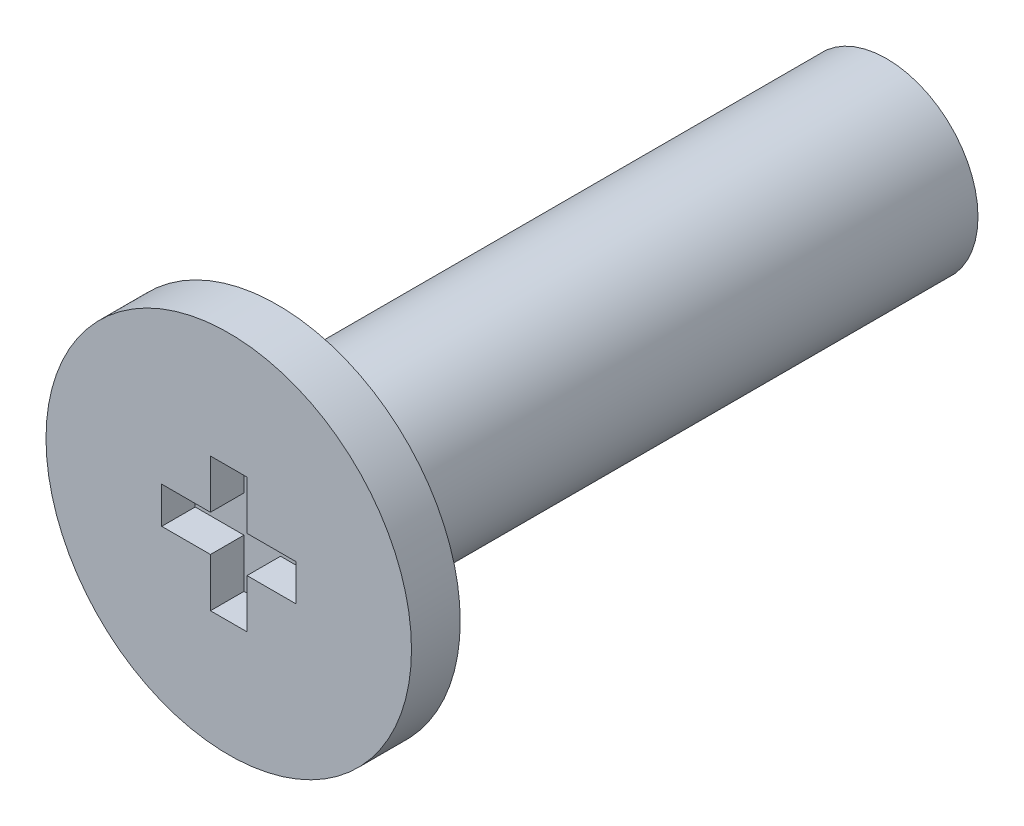
ISO-10303-21;
HEADER;
FILE_DESCRIPTION(('STEP AP214'),'2;1');
FILE_NAME('part.step','',(''),(''),'','','');
FILE_SCHEMA(('AUTOMOTIVE_DESIGN { 1 0 10303 214 1 1 1 1 }'));
ENDSEC;
DATA;
#1=APPLICATION_CONTEXT('core data for automotive mechanical design processes');
#2=APPLICATION_PROTOCOL_DEFINITION('international standard','automotive_design',2000,#1);
#3=PRODUCT_CONTEXT('',#1,'mechanical');
#4=PRODUCT('Part','Part','',(#3));
#5=PRODUCT_RELATED_PRODUCT_CATEGORY('part','',(#4));
#6=PRODUCT_DEFINITION_FORMATION('','',#4);
#7=PRODUCT_DEFINITION_CONTEXT('part definition',#1,'design');
#8=PRODUCT_DEFINITION('design','',#6,#7);
#9=PRODUCT_DEFINITION_SHAPE('','',#8);
#10=(LENGTH_UNIT() NAMED_UNIT(*) SI_UNIT(.MILLI.,.METRE.));
#11=(NAMED_UNIT(*) PLANE_ANGLE_UNIT() SI_UNIT($,.RADIAN.));
#12=(NAMED_UNIT(*) SI_UNIT($,.STERADIAN.) SOLID_ANGLE_UNIT());
#13=UNCERTAINTY_MEASURE_WITH_UNIT(LENGTH_MEASURE(1.E-05),#10,'distance_accuracy_value','');
#14=(GEOMETRIC_REPRESENTATION_CONTEXT(3) GLOBAL_UNCERTAINTY_ASSIGNED_CONTEXT((#13)) GLOBAL_UNIT_ASSIGNED_CONTEXT((#10,
#11,#12)) REPRESENTATION_CONTEXT('',''));
#15=CARTESIAN_POINT('',(0.,0.,0.));
#16=DIRECTION('',(0.,0.,1.));
#17=DIRECTION('',(1.,0.,0.));
#18=AXIS2_PLACEMENT_3D('',#15,#16,#17);
#19=CARTESIAN_POINT('',(0.,0.,-10.));
#20=DIRECTION('',(0.,0.,1.));
#21=DIRECTION('',(1.,0.,0.));
#22=AXIS2_PLACEMENT_3D('',#19,#20,#21);
#23=CYLINDRICAL_SURFACE('',#22,1.5);
#24=CARTESIAN_POINT('',(0.,0.,-10.));
#25=DIRECTION('',(0.,0.,1.));
#26=DIRECTION('',(1.,0.,0.));
#27=AXIS2_PLACEMENT_3D('',#24,#25,#26);
#28=CIRCLE('',#27,1.5);
#29=CARTESIAN_POINT('',(1.5,0.,-10.));
#30=VERTEX_POINT('',#29);
#31=EDGE_CURVE('E212',#30,#30,#28,.T.);
#32=ORIENTED_EDGE('',*,*,#31,.T.);
#33=EDGE_LOOP('',(#32));
#34=FACE_BOUND('',#33,.T.);
#35=CARTESIAN_POINT('',(0.,0.,0.));
#36=DIRECTION('',(0.,0.,1.));
#37=DIRECTION('',(1.,0.,0.));
#38=AXIS2_PLACEMENT_3D('',#35,#36,#37);
#39=CIRCLE('',#38,1.5);
#40=CARTESIAN_POINT('',(1.5,0.,0.));
#41=VERTEX_POINT('',#40);
#42=EDGE_CURVE('E208',#41,#41,#39,.T.);
#43=ORIENTED_EDGE('',*,*,#42,.F.);
#44=EDGE_LOOP('',(#43));
#45=FACE_BOUND('',#44,.T.);
#46=ADVANCED_FACE('F41',(#34,#45),#23,.T.);
#47=CARTESIAN_POINT('',(0.,0.,-10.));
#48=DIRECTION('',(0.,0.,1.));
#49=DIRECTION('',(1.,0.,0.));
#50=AXIS2_PLACEMENT_3D('',#47,#48,#49);
#51=PLANE('',#50);
#52=ORIENTED_EDGE('',*,*,#31,.F.);
#53=EDGE_LOOP('',(#52));
#54=FACE_BOUND('',#53,.T.);
#55=ADVANCED_FACE('F281',(#54),#51,.F.);
#56=CARTESIAN_POINT('',(0.,0.,0.));
#57=DIRECTION('',(0.,0.,1.));
#58=DIRECTION('',(1.,0.,0.));
#59=AXIS2_PLACEMENT_3D('',#56,#57,#58);
#60=PLANE('',#59);
#61=ORIENTED_EDGE('',*,*,#42,.T.);
#62=EDGE_LOOP('',(#61));
#63=FACE_BOUND('',#62,.T.);
#64=CARTESIAN_POINT('',(0.,0.,0.));
#65=DIRECTION('',(0.,0.,-1.));
#66=DIRECTION('',(-1.,0.,0.));
#67=AXIS2_PLACEMENT_3D('',#64,#65,#66);
#68=CIRCLE('',#67,3.);
#69=CARTESIAN_POINT('',(-3.,0.,0.));
#70=VERTEX_POINT('',#69);
#71=EDGE_CURVE('E210',#70,#70,#68,.T.);
#72=ORIENTED_EDGE('',*,*,#71,.T.);
#73=EDGE_LOOP('',(#72));
#74=FACE_BOUND('',#73,.T.);
#75=ADVANCED_FACE('F286',(#63,#74),#60,.F.);
#76=CARTESIAN_POINT('',(0.,0.,-2.));
#77=DIRECTION('',(0.,0.,-1.));
#78=DIRECTION('',(-1.,0.,0.));
#79=AXIS2_PLACEMENT_3D('',#76,#77,#78);
#80=CYLINDRICAL_SURFACE('',#79,3.);
#81=ORIENTED_EDGE('',*,*,#71,.F.);
#82=EDGE_LOOP('',(#81));
#83=FACE_BOUND('',#82,.T.);
#84=CARTESIAN_POINT('',(0.,0.,0.8));
#85=DIRECTION('',(0.,0.,-1.));
#86=DIRECTION('',(-1.,0.,0.));
#87=AXIS2_PLACEMENT_3D('',#84,#85,#86);
#88=CIRCLE('',#87,3.);
#89=CARTESIAN_POINT('',(-3.,0.,0.8));
#90=VERTEX_POINT('',#89);
#91=EDGE_CURVE('E179',#90,#90,#88,.T.);
#92=ORIENTED_EDGE('',*,*,#91,.T.);
#93=EDGE_LOOP('',(#92));
#94=FACE_BOUND('',#93,.T.);
#95=ADVANCED_FACE('F300',(#83,#94),#80,.T.);
#96=CARTESIAN_POINT('',(3.,0.,0.8));
#97=DIRECTION('',(0.,0.,-1.));
#98=DIRECTION('',(-1.,0.,0.));
#99=AXIS2_PLACEMENT_3D('',#96,#97,#98);
#100=PLANE('',#99);
#101=DIRECTION('',(-1.,0.,0.));
#102=VECTOR('',#101,1.);
#103=CARTESIAN_POINT('',(3.,-1.1,0.8));
#104=LINE('',#103,#102);
#105=CARTESIAN_POINT('',(0.3,-1.1,0.8));
#106=VERTEX_POINT('',#105);
#107=CARTESIAN_POINT('',(-0.3,-1.1,0.8));
#108=VERTEX_POINT('',#107);
#109=EDGE_CURVE('E211',#106,#108,#104,.T.);
#110=ORIENTED_EDGE('',*,*,#109,.T.);
#111=DIRECTION('',(0.,1.,0.));
#112=VECTOR('',#111,1.);
#113=CARTESIAN_POINT('',(-0.3,0.,0.8));
#114=LINE('',#113,#112);
#115=CARTESIAN_POINT('',(-0.3,-0.3,0.8));
#116=VERTEX_POINT('',#115);
#117=EDGE_CURVE('E11',#108,#116,#114,.T.);
#118=ORIENTED_EDGE('',*,*,#117,.T.);
#119=DIRECTION('',(-1.,0.,0.));
#120=VECTOR('',#119,1.);
#121=CARTESIAN_POINT('',(3.,-0.3,0.8));
#122=LINE('',#121,#120);
#123=CARTESIAN_POINT('',(-1.1,-0.3,0.8));
#124=VERTEX_POINT('',#123);
#125=EDGE_CURVE('E48',#116,#124,#122,.T.);
#126=ORIENTED_EDGE('',*,*,#125,.T.);
#127=DIRECTION('',(0.,1.,0.));
#128=VECTOR('',#127,1.);
#129=CARTESIAN_POINT('',(-1.1,0.,0.8));
#130=LINE('',#129,#128);
#131=CARTESIAN_POINT('',(-1.1,0.3,0.8));
#132=VERTEX_POINT('',#131);
#133=EDGE_CURVE('E241',#124,#132,#130,.T.);
#134=ORIENTED_EDGE('',*,*,#133,.T.);
#135=DIRECTION('',(1.,0.,0.));
#136=VECTOR('',#135,1.);
#137=CARTESIAN_POINT('',(3.,0.3,0.8));
#138=LINE('',#137,#136);
#139=CARTESIAN_POINT('',(-0.3,0.3,0.8));
#140=VERTEX_POINT('',#139);
#141=EDGE_CURVE('E236',#132,#140,#138,.T.);
#142=ORIENTED_EDGE('',*,*,#141,.T.);
#143=DIRECTION('',(0.,1.,0.));
#144=VECTOR('',#143,1.);
#145=CARTESIAN_POINT('',(-0.3,0.,0.8));
#146=LINE('',#145,#144);
#147=CARTESIAN_POINT('',(-0.3,1.1,0.8));
#148=VERTEX_POINT('',#147);
#149=EDGE_CURVE('E237',#140,#148,#146,.T.);
#150=ORIENTED_EDGE('',*,*,#149,.T.);
#151=DIRECTION('',(1.,0.,0.));
#152=VECTOR('',#151,1.);
#153=CARTESIAN_POINT('',(3.,1.1,0.8));
#154=LINE('',#153,#152);
#155=CARTESIAN_POINT('',(0.3,1.1,0.8));
#156=VERTEX_POINT('',#155);
#157=EDGE_CURVE('E231',#148,#156,#154,.T.);
#158=ORIENTED_EDGE('',*,*,#157,.T.);
#159=DIRECTION('',(0.,-1.,0.));
#160=VECTOR('',#159,1.);
#161=CARTESIAN_POINT('',(0.3,0.,0.8));
#162=LINE('',#161,#160);
#163=CARTESIAN_POINT('',(0.3,0.3,0.8));
#164=VERTEX_POINT('',#163);
#165=EDGE_CURVE('E228',#156,#164,#162,.T.);
#166=ORIENTED_EDGE('',*,*,#165,.T.);
#167=DIRECTION('',(1.,0.,0.));
#168=VECTOR('',#167,1.);
#169=CARTESIAN_POINT('',(3.,0.3,0.8));
#170=LINE('',#169,#168);
#171=CARTESIAN_POINT('',(1.1,0.3,0.8));
#172=VERTEX_POINT('',#171);
#173=EDGE_CURVE('E229',#164,#172,#170,.T.);
#174=ORIENTED_EDGE('',*,*,#173,.T.);
#175=DIRECTION('',(0.,-1.,0.));
#176=VECTOR('',#175,1.);
#177=CARTESIAN_POINT('',(1.1,0.,0.8));
#178=LINE('',#177,#176);
#179=CARTESIAN_POINT('',(1.1,-0.3,0.8));
#180=VERTEX_POINT('',#179);
#181=EDGE_CURVE('E224',#172,#180,#178,.T.);
#182=ORIENTED_EDGE('',*,*,#181,.T.);
#183=DIRECTION('',(-1.,0.,0.));
#184=VECTOR('',#183,1.);
#185=CARTESIAN_POINT('',(3.,-0.3,0.8));
#186=LINE('',#185,#184);
#187=CARTESIAN_POINT('',(0.3,-0.3,0.8));
#188=VERTEX_POINT('',#187);
#189=EDGE_CURVE('E222',#180,#188,#186,.T.);
#190=ORIENTED_EDGE('',*,*,#189,.T.);
#191=DIRECTION('',(0.,-1.,0.));
#192=VECTOR('',#191,1.);
#193=CARTESIAN_POINT('',(0.3,0.,0.8));
#194=LINE('',#193,#192);
#195=EDGE_CURVE('E220',#188,#106,#194,.T.);
#196=ORIENTED_EDGE('',*,*,#195,.T.);
#197=EDGE_LOOP('',(#110,#118,#126,#134,#142,#150,#158,#166,#174,#182,#190,#196));
#198=FACE_BOUND('',#197,.T.);
#199=ORIENTED_EDGE('',*,*,#91,.F.);
#200=EDGE_LOOP('',(#199));
#201=FACE_BOUND('',#200,.T.);
#202=ADVANCED_FACE('F242',(#198,#201),#100,.F.);
#203=CARTESIAN_POINT('',(-0.3,-0.3,0.25));
#204=DIRECTION('',(-1.,0.,0.));
#205=DIRECTION('',(0.,0.,1.));
#206=AXIS2_PLACEMENT_3D('',#203,#204,#205);
#207=PLANE('',#206);
#208=DIRECTION('',(0.,0.,1.));
#209=VECTOR('',#208,1.);
#210=CARTESIAN_POINT('',(-0.3,-1.1,0.25));
#211=LINE('',#210,#209);
#212=CARTESIAN_POINT('',(-0.3,-1.1,0.25));
#213=VERTEX_POINT('',#212);
#214=EDGE_CURVE('E54',#213,#108,#211,.T.);
#215=ORIENTED_EDGE('',*,*,#214,.F.);
#216=DIRECTION('',(0.,-1.,0.));
#217=VECTOR('',#216,1.);
#218=CARTESIAN_POINT('',(-0.3,-0.3,0.25));
#219=LINE('',#218,#217);
#220=CARTESIAN_POINT('',(-0.3,-0.3,0.25));
#221=VERTEX_POINT('',#220);
#222=EDGE_CURVE('E129',#221,#213,#219,.T.);
#223=ORIENTED_EDGE('',*,*,#222,.F.);
#224=DIRECTION('',(0.,0.,1.));
#225=VECTOR('',#224,1.);
#226=CARTESIAN_POINT('',(-0.3,-0.3,0.25));
#227=LINE('',#226,#225);
#228=EDGE_CURVE('E171',#221,#116,#227,.T.);
#229=ORIENTED_EDGE('',*,*,#228,.T.);
#230=ORIENTED_EDGE('',*,*,#117,.F.);
#231=EDGE_LOOP('',(#215,#223,#229,#230));
#232=FACE_BOUND('',#231,.T.);
#233=ADVANCED_FACE('F127',(#232),#207,.F.);
#234=CARTESIAN_POINT('',(-1.1,-0.3,0.25));
#235=DIRECTION('',(0.,-1.,0.));
#236=DIRECTION('',(0.,0.,-1.));
#237=AXIS2_PLACEMENT_3D('',#234,#235,#236);
#238=PLANE('',#237);
#239=ORIENTED_EDGE('',*,*,#228,.F.);
#240=DIRECTION('',(1.,0.,0.));
#241=VECTOR('',#240,1.);
#242=CARTESIAN_POINT('',(-1.1,-0.3,0.25));
#243=LINE('',#242,#241);
#244=CARTESIAN_POINT('',(-1.1,-0.3,0.25));
#245=VERTEX_POINT('',#244);
#246=EDGE_CURVE('E131',#245,#221,#243,.T.);
#247=ORIENTED_EDGE('',*,*,#246,.F.);
#248=DIRECTION('',(0.,0.,1.));
#249=VECTOR('',#248,1.);
#250=CARTESIAN_POINT('',(-1.1,-0.3,0.25));
#251=LINE('',#250,#249);
#252=EDGE_CURVE('E180',#245,#124,#251,.T.);
#253=ORIENTED_EDGE('',*,*,#252,.T.);
#254=ORIENTED_EDGE('',*,*,#125,.F.);
#255=EDGE_LOOP('',(#239,#247,#253,#254));
#256=FACE_BOUND('',#255,.T.);
#257=ADVANCED_FACE('F273',(#256),#238,.F.);
#258=CARTESIAN_POINT('',(-1.1,0.3,0.25));
#259=DIRECTION('',(-1.,0.,0.));
#260=DIRECTION('',(0.,0.,1.));
#261=AXIS2_PLACEMENT_3D('',#258,#259,#260);
#262=PLANE('',#261);
#263=ORIENTED_EDGE('',*,*,#252,.F.);
#264=DIRECTION('',(0.,-1.,0.));
#265=VECTOR('',#264,1.);
#266=CARTESIAN_POINT('',(-1.1,0.3,0.25));
#267=LINE('',#266,#265);
#268=CARTESIAN_POINT('',(-1.1,0.3,0.25));
#269=VERTEX_POINT('',#268);
#270=EDGE_CURVE('E175',#269,#245,#267,.T.);
#271=ORIENTED_EDGE('',*,*,#270,.F.);
#272=DIRECTION('',(0.,0.,1.));
#273=VECTOR('',#272,1.);
#274=CARTESIAN_POINT('',(-1.1,0.3,0.25));
#275=LINE('',#274,#273);
#276=EDGE_CURVE('E178',#269,#132,#275,.T.);
#277=ORIENTED_EDGE('',*,*,#276,.T.);
#278=ORIENTED_EDGE('',*,*,#133,.F.);
#279=EDGE_LOOP('',(#263,#271,#277,#278));
#280=FACE_BOUND('',#279,.T.);
#281=ADVANCED_FACE('F275',(#280),#262,.F.);
#282=CARTESIAN_POINT('',(-0.3,0.3,0.25));
#283=DIRECTION('',(0.,1.,0.));
#284=DIRECTION('',(0.,0.,1.));
#285=AXIS2_PLACEMENT_3D('',#282,#283,#284);
#286=PLANE('',#285);
#287=ORIENTED_EDGE('',*,*,#276,.F.);
#288=DIRECTION('',(-1.,0.,0.));
#289=VECTOR('',#288,1.);
#290=CARTESIAN_POINT('',(-0.3,0.3,0.25));
#291=LINE('',#290,#289);
#292=CARTESIAN_POINT('',(-0.3,0.3,0.25));
#293=VERTEX_POINT('',#292);
#294=EDGE_CURVE('E168',#293,#269,#291,.T.);
#295=ORIENTED_EDGE('',*,*,#294,.F.);
#296=DIRECTION('',(0.,0.,1.));
#297=VECTOR('',#296,1.);
#298=CARTESIAN_POINT('',(-0.3,0.3,0.25));
#299=LINE('',#298,#297);
#300=EDGE_CURVE('E181',#293,#140,#299,.T.);
#301=ORIENTED_EDGE('',*,*,#300,.T.);
#302=ORIENTED_EDGE('',*,*,#141,.F.);
#303=EDGE_LOOP('',(#287,#295,#301,#302));
#304=FACE_BOUND('',#303,.T.);
#305=ADVANCED_FACE('F269',(#304),#286,.F.);
#306=CARTESIAN_POINT('',(-0.3,1.1,0.25));
#307=DIRECTION('',(-1.,0.,0.));
#308=DIRECTION('',(0.,0.,1.));
#309=AXIS2_PLACEMENT_3D('',#306,#307,#308);
#310=PLANE('',#309);
#311=ORIENTED_EDGE('',*,*,#300,.F.);
#312=DIRECTION('',(0.,-1.,0.));
#313=VECTOR('',#312,1.);
#314=CARTESIAN_POINT('',(-0.3,1.1,0.25));
#315=LINE('',#314,#313);
#316=CARTESIAN_POINT('',(-0.3,1.1,0.25));
#317=VERTEX_POINT('',#316);
#318=EDGE_CURVE('E169',#317,#293,#315,.T.);
#319=ORIENTED_EDGE('',*,*,#318,.F.);
#320=DIRECTION('',(0.,0.,1.));
#321=VECTOR('',#320,1.);
#322=CARTESIAN_POINT('',(-0.3,1.1,0.25));
#323=LINE('',#322,#321);
#324=EDGE_CURVE('E188',#317,#148,#323,.T.);
#325=ORIENTED_EDGE('',*,*,#324,.T.);
#326=ORIENTED_EDGE('',*,*,#149,.F.);
#327=EDGE_LOOP('',(#311,#319,#325,#326));
#328=FACE_BOUND('',#327,.T.);
#329=ADVANCED_FACE('F266',(#328),#310,.F.);
#330=CARTESIAN_POINT('',(0.3,1.1,0.25));
#331=DIRECTION('',(0.,1.,0.));
#332=DIRECTION('',(0.,0.,1.));
#333=AXIS2_PLACEMENT_3D('',#330,#331,#332);
#334=PLANE('',#333);
#335=ORIENTED_EDGE('',*,*,#324,.F.);
#336=DIRECTION('',(-1.,0.,0.));
#337=VECTOR('',#336,1.);
#338=CARTESIAN_POINT('',(0.3,1.1,0.25));
#339=LINE('',#338,#337);
#340=CARTESIAN_POINT('',(0.3,1.1,0.25));
#341=VERTEX_POINT('',#340);
#342=EDGE_CURVE('E164',#341,#317,#339,.T.);
#343=ORIENTED_EDGE('',*,*,#342,.F.);
#344=DIRECTION('',(0.,0.,1.));
#345=VECTOR('',#344,1.);
#346=CARTESIAN_POINT('',(0.3,1.1,0.25));
#347=LINE('',#346,#345);
#348=EDGE_CURVE('E189',#341,#156,#347,.T.);
#349=ORIENTED_EDGE('',*,*,#348,.T.);
#350=ORIENTED_EDGE('',*,*,#157,.F.);
#351=EDGE_LOOP('',(#335,#343,#349,#350));
#352=FACE_BOUND('',#351,.T.);
#353=ADVANCED_FACE('F261',(#352),#334,.F.);
#354=CARTESIAN_POINT('',(0.3,0.3,0.25));
#355=DIRECTION('',(1.,0.,0.));
#356=DIRECTION('',(0.,0.,-1.));
#357=AXIS2_PLACEMENT_3D('',#354,#355,#356);
#358=PLANE('',#357);
#359=ORIENTED_EDGE('',*,*,#348,.F.);
#360=DIRECTION('',(0.,1.,0.));
#361=VECTOR('',#360,1.);
#362=CARTESIAN_POINT('',(0.3,0.3,0.25));
#363=LINE('',#362,#361);
#364=CARTESIAN_POINT('',(0.3,0.3,0.25));
#365=VERTEX_POINT('',#364);
#366=EDGE_CURVE('E158',#365,#341,#363,.T.);
#367=ORIENTED_EDGE('',*,*,#366,.F.);
#368=DIRECTION('',(0.,0.,1.));
#369=VECTOR('',#368,1.);
#370=CARTESIAN_POINT('',(0.3,0.3,0.25));
#371=LINE('',#370,#369);
#372=EDGE_CURVE('E195',#365,#164,#371,.T.);
#373=ORIENTED_EDGE('',*,*,#372,.T.);
#374=ORIENTED_EDGE('',*,*,#165,.F.);
#375=EDGE_LOOP('',(#359,#367,#373,#374));
#376=FACE_BOUND('',#375,.T.);
#377=ADVANCED_FACE('F263',(#376),#358,.F.);
#378=CARTESIAN_POINT('',(1.1,0.3,0.25));
#379=DIRECTION('',(0.,1.,0.));
#380=DIRECTION('',(0.,0.,1.));
#381=AXIS2_PLACEMENT_3D('',#378,#379,#380);
#382=PLANE('',#381);
#383=ORIENTED_EDGE('',*,*,#372,.F.);
#384=DIRECTION('',(-1.,0.,0.));
#385=VECTOR('',#384,1.);
#386=CARTESIAN_POINT('',(1.1,0.3,0.25));
#387=LINE('',#386,#385);
#388=CARTESIAN_POINT('',(1.1,0.3,0.25));
#389=VERTEX_POINT('',#388);
#390=EDGE_CURVE('E160',#389,#365,#387,.T.);
#391=ORIENTED_EDGE('',*,*,#390,.F.);
#392=DIRECTION('',(0.,0.,1.));
#393=VECTOR('',#392,1.);
#394=CARTESIAN_POINT('',(1.1,0.3,0.25));
#395=LINE('',#394,#393);
#396=EDGE_CURVE('E194',#389,#172,#395,.T.);
#397=ORIENTED_EDGE('',*,*,#396,.T.);
#398=ORIENTED_EDGE('',*,*,#173,.F.);
#399=EDGE_LOOP('',(#383,#391,#397,#398));
#400=FACE_BOUND('',#399,.T.);
#401=ADVANCED_FACE('F257',(#400),#382,.F.);
#402=CARTESIAN_POINT('',(1.1,-0.3,0.25));
#403=DIRECTION('',(1.,0.,0.));
#404=DIRECTION('',(0.,0.,-1.));
#405=AXIS2_PLACEMENT_3D('',#402,#403,#404);
#406=PLANE('',#405);
#407=ORIENTED_EDGE('',*,*,#396,.F.);
#408=DIRECTION('',(0.,1.,0.));
#409=VECTOR('',#408,1.);
#410=CARTESIAN_POINT('',(1.1,-0.3,0.25));
#411=LINE('',#410,#409);
#412=CARTESIAN_POINT('',(1.1,-0.3,0.25));
#413=VERTEX_POINT('',#412);
#414=EDGE_CURVE('E151',#413,#389,#411,.T.);
#415=ORIENTED_EDGE('',*,*,#414,.F.);
#416=DIRECTION('',(0.,0.,1.));
#417=VECTOR('',#416,1.);
#418=CARTESIAN_POINT('',(1.1,-0.3,0.25));
#419=LINE('',#418,#417);
#420=EDGE_CURVE('E198',#413,#180,#419,.T.);
#421=ORIENTED_EDGE('',*,*,#420,.T.);
#422=ORIENTED_EDGE('',*,*,#181,.F.);
#423=EDGE_LOOP('',(#407,#415,#421,#422));
#424=FACE_BOUND('',#423,.T.);
#425=ADVANCED_FACE('F251',(#424),#406,.F.);
#426=CARTESIAN_POINT('',(0.3,-0.3,0.25));
#427=DIRECTION('',(0.,-1.,0.));
#428=DIRECTION('',(0.,0.,-1.));
#429=AXIS2_PLACEMENT_3D('',#426,#427,#428);
#430=PLANE('',#429);
#431=ORIENTED_EDGE('',*,*,#420,.F.);
#432=DIRECTION('',(1.,0.,0.));
#433=VECTOR('',#432,1.);
#434=CARTESIAN_POINT('',(0.3,-0.3,0.25));
#435=LINE('',#434,#433);
#436=CARTESIAN_POINT('',(0.3,-0.3,0.25));
#437=VERTEX_POINT('',#436);
#438=EDGE_CURVE('E152',#437,#413,#435,.T.);
#439=ORIENTED_EDGE('',*,*,#438,.F.);
#440=DIRECTION('',(0.,0.,1.));
#441=VECTOR('',#440,1.);
#442=CARTESIAN_POINT('',(0.3,-0.3,0.25));
#443=LINE('',#442,#441);
#444=EDGE_CURVE('E201',#437,#188,#443,.T.);
#445=ORIENTED_EDGE('',*,*,#444,.T.);
#446=ORIENTED_EDGE('',*,*,#189,.F.);
#447=EDGE_LOOP('',(#431,#439,#445,#446));
#448=FACE_BOUND('',#447,.T.);
#449=ADVANCED_FACE('F254',(#448),#430,.F.);
#450=CARTESIAN_POINT('',(0.3,-1.1,0.25));
#451=DIRECTION('',(1.,0.,0.));
#452=DIRECTION('',(0.,0.,-1.));
#453=AXIS2_PLACEMENT_3D('',#450,#451,#452);
#454=PLANE('',#453);
#455=ORIENTED_EDGE('',*,*,#444,.F.);
#456=DIRECTION('',(0.,1.,0.));
#457=VECTOR('',#456,1.);
#458=CARTESIAN_POINT('',(0.3,-1.1,0.25));
#459=LINE('',#458,#457);
#460=CARTESIAN_POINT('',(0.3,-1.1,0.25));
#461=VERTEX_POINT('',#460);
#462=EDGE_CURVE('E145',#461,#437,#459,.T.);
#463=ORIENTED_EDGE('',*,*,#462,.F.);
#464=DIRECTION('',(0.,0.,1.));
#465=VECTOR('',#464,1.);
#466=CARTESIAN_POINT('',(0.3,-1.1,0.25));
#467=LINE('',#466,#465);
#468=EDGE_CURVE('E134',#461,#106,#467,.T.);
#469=ORIENTED_EDGE('',*,*,#468,.T.);
#470=ORIENTED_EDGE('',*,*,#195,.F.);
#471=EDGE_LOOP('',(#455,#463,#469,#470));
#472=FACE_BOUND('',#471,.T.);
#473=ADVANCED_FACE('F248',(#472),#454,.F.);
#474=CARTESIAN_POINT('',(-0.3,-1.1,0.25));
#475=DIRECTION('',(0.,-1.,0.));
#476=DIRECTION('',(0.,0.,-1.));
#477=AXIS2_PLACEMENT_3D('',#474,#475,#476);
#478=PLANE('',#477);
#479=ORIENTED_EDGE('',*,*,#468,.F.);
#480=DIRECTION('',(1.,0.,0.));
#481=VECTOR('',#480,1.);
#482=CARTESIAN_POINT('',(-0.3,-1.1,0.25));
#483=LINE('',#482,#481);
#484=EDGE_CURVE('E140',#213,#461,#483,.T.);
#485=ORIENTED_EDGE('',*,*,#484,.F.);
#486=ORIENTED_EDGE('',*,*,#214,.T.);
#487=ORIENTED_EDGE('',*,*,#109,.F.);
#488=EDGE_LOOP('',(#479,#485,#486,#487));
#489=FACE_BOUND('',#488,.T.);
#490=ADVANCED_FACE('F139',(#489),#478,.F.);
#491=CARTESIAN_POINT('',(0.,0.,0.25));
#492=DIRECTION('',(0.,0.,1.));
#493=DIRECTION('',(1.,0.,0.));
#494=AXIS2_PLACEMENT_3D('',#491,#492,#493);
#495=PLANE('',#494);
#496=ORIENTED_EDGE('',*,*,#222,.T.);
#497=ORIENTED_EDGE('',*,*,#484,.T.);
#498=ORIENTED_EDGE('',*,*,#462,.T.);
#499=ORIENTED_EDGE('',*,*,#438,.T.);
#500=ORIENTED_EDGE('',*,*,#414,.T.);
#501=ORIENTED_EDGE('',*,*,#390,.T.);
#502=ORIENTED_EDGE('',*,*,#366,.T.);
#503=ORIENTED_EDGE('',*,*,#342,.T.);
#504=ORIENTED_EDGE('',*,*,#318,.T.);
#505=ORIENTED_EDGE('',*,*,#294,.T.);
#506=ORIENTED_EDGE('',*,*,#270,.T.);
#507=ORIENTED_EDGE('',*,*,#246,.T.);
#508=EDGE_LOOP('',(#496,#497,#498,#499,#500,#501,#502,#503,#504,#505,#506,#507));
#509=FACE_BOUND('',#508,.T.);
#510=ADVANCED_FACE('F142',(#509),#495,.T.);
#511=CLOSED_SHELL('',(#46,#55,#75,#95,#202,#233,#257,#281,#305,#329,#353,#377,#401,#425,#449,
#473,#490,#510));
#512=MANIFOLD_SOLID_BREP('B2',#511);
#513=ADVANCED_BREP_SHAPE_REPRESENTATION('',(#18,#512),#14);
#514=SHAPE_DEFINITION_REPRESENTATION(#9,#513);
ENDSEC;
END-ISO-10303-21;
